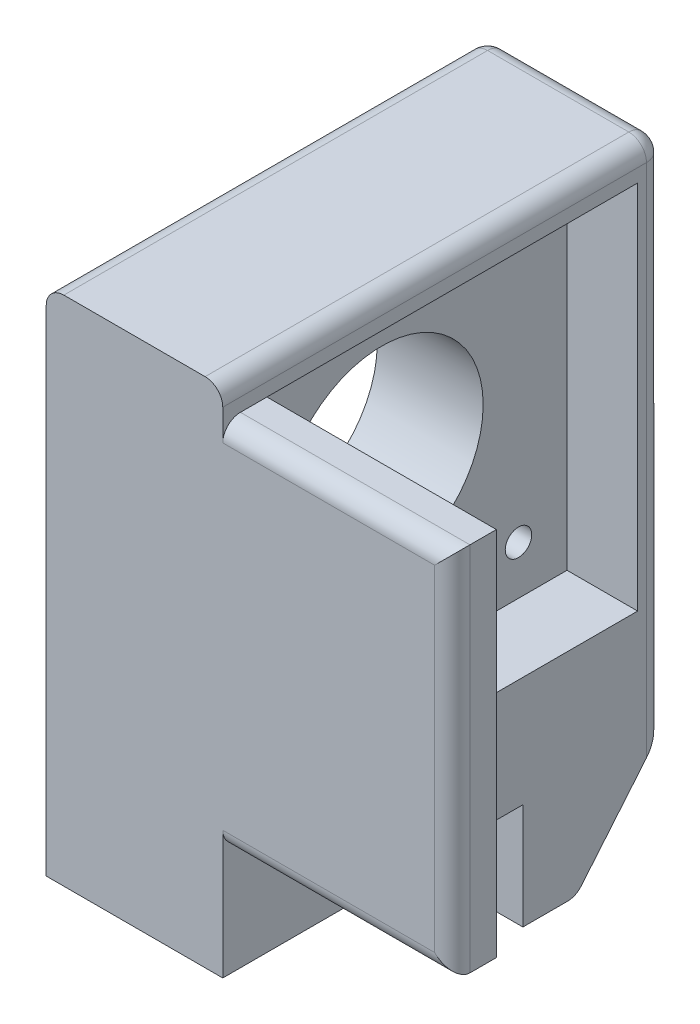
ISO-10303-21;
HEADER;
FILE_DESCRIPTION(('STEP AP214'),'2;1');
FILE_NAME('part.step','',(''),(''),'','','');
FILE_SCHEMA(('AUTOMOTIVE_DESIGN { 1 0 10303 214 1 1 1 1 }'));
ENDSEC;
DATA;
#1=APPLICATION_CONTEXT('core data for automotive mechanical design processes');
#2=APPLICATION_PROTOCOL_DEFINITION('international standard','automotive_design',2000,#1);
#3=PRODUCT_CONTEXT('',#1,'mechanical');
#4=PRODUCT('Part','Part','',(#3));
#5=PRODUCT_RELATED_PRODUCT_CATEGORY('part','',(#4));
#6=PRODUCT_DEFINITION_FORMATION('','',#4);
#7=PRODUCT_DEFINITION_CONTEXT('part definition',#1,'design');
#8=PRODUCT_DEFINITION('design','',#6,#7);
#9=PRODUCT_DEFINITION_SHAPE('','',#8);
#10=(LENGTH_UNIT() NAMED_UNIT(*) SI_UNIT(.MILLI.,.METRE.));
#11=(NAMED_UNIT(*) PLANE_ANGLE_UNIT() SI_UNIT($,.RADIAN.));
#12=(NAMED_UNIT(*) SI_UNIT($,.STERADIAN.) SOLID_ANGLE_UNIT());
#13=UNCERTAINTY_MEASURE_WITH_UNIT(LENGTH_MEASURE(1.E-05),#10,'distance_accuracy_value','');
#14=(GEOMETRIC_REPRESENTATION_CONTEXT(3) GLOBAL_UNCERTAINTY_ASSIGNED_CONTEXT((#13)) GLOBAL_UNIT_ASSIGNED_CONTEXT((#10,
#11,#12)) REPRESENTATION_CONTEXT('',''));
#15=CARTESIAN_POINT('',(0.,0.,0.));
#16=DIRECTION('',(0.,0.,1.));
#17=DIRECTION('',(1.,0.,0.));
#18=AXIS2_PLACEMENT_3D('',#15,#16,#17);
#19=CARTESIAN_POINT('',(0.,70.,0.));
#20=DIRECTION('',(-1.,0.,0.));
#21=DIRECTION('',(0.,0.,1.));
#22=AXIS2_PLACEMENT_3D('',#19,#20,#21);
#23=PLANE('',#22);
#24=DIRECTION('',(0.,0.,1.));
#25=VECTOR('',#24,1.);
#26=CARTESIAN_POINT('',(0.,66.5,45.));
#27=LINE('',#26,#25);
#28=CARTESIAN_POINT('',(0.,66.5,45.));
#29=VERTEX_POINT('',#28);
#30=CARTESIAN_POINT('',(0.,66.5,48.));
#31=VERTEX_POINT('',#30);
#32=EDGE_CURVE('E420',#29,#31,#27,.T.);
#33=ORIENTED_EDGE('',*,*,#32,.F.);
#34=DIRECTION('',(0.,0.,1.));
#35=VECTOR('',#34,1.);
#36=CARTESIAN_POINT('',(0.,66.5,3.));
#37=LINE('',#36,#35);
#38=CARTESIAN_POINT('',(0.,66.5,3.));
#39=VERTEX_POINT('',#38);
#40=EDGE_CURVE('E263',#39,#29,#37,.T.);
#41=ORIENTED_EDGE('',*,*,#40,.F.);
#42=DIRECTION('',(0.,1.,0.));
#43=VECTOR('',#42,1.);
#44=CARTESIAN_POINT('',(0.,66.5,3.));
#45=LINE('',#44,#43);
#46=CARTESIAN_POINT('',(0.,24.5,3.));
#47=VERTEX_POINT('',#46);
#48=EDGE_CURVE('E247',#47,#39,#45,.T.);
#49=ORIENTED_EDGE('',*,*,#48,.F.);
#50=DIRECTION('',(0.,0.,-1.));
#51=VECTOR('',#50,1.);
#52=CARTESIAN_POINT('',(0.,24.5,3.));
#53=LINE('',#52,#51);
#54=CARTESIAN_POINT('',(0.,24.5,45.));
#55=VERTEX_POINT('',#54);
#56=EDGE_CURVE('E252',#55,#47,#53,.T.);
#57=ORIENTED_EDGE('',*,*,#56,.F.);
#58=DIRECTION('',(0.,0.,-1.));
#59=VECTOR('',#58,1.);
#60=CARTESIAN_POINT('',(0.,24.5,45.));
#61=LINE('',#60,#59);
#62=CARTESIAN_POINT('',(0.,24.5,48.));
#63=VERTEX_POINT('',#62);
#64=EDGE_CURVE('E201',#63,#55,#61,.T.);
#65=ORIENTED_EDGE('',*,*,#64,.F.);
#66=CARTESIAN_POINT('',(0.,26.5,48.));
#67=DIRECTION('',(-1.,0.,0.));
#68=DIRECTION('',(0.,0.,1.));
#69=AXIS2_PLACEMENT_3D('',#66,#67,#68);
#70=CIRCLE('',#69,2.);
#71=CARTESIAN_POINT('',(0.,26.5,50.));
#72=VERTEX_POINT('',#71);
#73=EDGE_CURVE('E11',#63,#72,#70,.T.);
#74=ORIENTED_EDGE('',*,*,#73,.T.);
#75=DIRECTION('',(0.,-1.,0.));
#76=VECTOR('',#75,1.);
#77=CARTESIAN_POINT('',(0.,70.,50.));
#78=LINE('',#77,#76);
#79=CARTESIAN_POINT('',(0.,12.,50.));
#80=VERTEX_POINT('',#79);
#81=EDGE_CURVE('E315',#72,#80,#78,.T.);
#82=ORIENTED_EDGE('',*,*,#81,.T.);
#83=DIRECTION('',(0.,0.,1.));
#84=VECTOR('',#83,1.);
#85=CARTESIAN_POINT('',(0.,12.,50.));
#86=LINE('',#85,#84);
#87=CARTESIAN_POINT('',(0.,12.,16.));
#88=VERTEX_POINT('',#87);
#89=EDGE_CURVE('E297',#88,#80,#86,.T.);
#90=ORIENTED_EDGE('',*,*,#89,.F.);
#91=DIRECTION('',(0.,1.,0.));
#92=VECTOR('',#91,1.);
#93=CARTESIAN_POINT('',(0.,0.,16.));
#94=LINE('',#93,#92);
#95=CARTESIAN_POINT('',(0.,0.,16.));
#96=VERTEX_POINT('',#95);
#97=EDGE_CURVE('E292',#96,#88,#94,.T.);
#98=ORIENTED_EDGE('',*,*,#97,.F.);
#99=DIRECTION('',(0.,0.,-1.));
#100=VECTOR('',#99,1.);
#101=CARTESIAN_POINT('',(0.,0.,0.));
#102=LINE('',#101,#100);
#103=CARTESIAN_POINT('',(0.,0.,10.9367498919689));
#104=VERTEX_POINT('',#103);
#105=EDGE_CURVE('E317',#96,#104,#102,.T.);
#106=ORIENTED_EDGE('',*,*,#105,.T.);
#107=CARTESIAN_POINT('',(0.,2.,10.9367498919689));
#108=DIRECTION('',(-1.,0.,0.));
#109=DIRECTION('',(0.,0.,1.));
#110=AXIS2_PLACEMENT_3D('',#107,#108,#109);
#111=CIRCLE('',#110,2.);
#112=CARTESIAN_POINT('',(0.,0.719631200671042,9.40030733277413));
#113=VERTEX_POINT('',#112);
#114=EDGE_CURVE('E398',#104,#113,#111,.F.);
#115=ORIENTED_EDGE('',*,*,#114,.T.);
#116=DIRECTION('',(0.,-0.768221279597376,0.64018439966448));
#117=VECTOR('',#116,1.);
#118=CARTESIAN_POINT('',(0.,12.,0.));
#119=LINE('',#118,#117);
#120=CARTESIAN_POINT('',(0.,9.6,2.));
#121=VERTEX_POINT('',#120);
#122=EDGE_CURVE('E237',#121,#113,#119,.T.);
#123=ORIENTED_EDGE('',*,*,#122,.F.);
#124=DIRECTION('',(0.,-1.,0.));
#125=VECTOR('',#124,1.);
#126=CARTESIAN_POINT('',(0.,70.,2.));
#127=LINE('',#126,#125);
#128=CARTESIAN_POINT('',(0.,68.,2.));
#129=VERTEX_POINT('',#128);
#130=EDGE_CURVE('E385',#121,#129,#127,.F.);
#131=ORIENTED_EDGE('',*,*,#130,.T.);
#132=DIRECTION('',(0.,0.,-1.));
#133=VECTOR('',#132,1.);
#134=CARTESIAN_POINT('',(0.,68.,0.));
#135=LINE('',#134,#133);
#136=CARTESIAN_POINT('',(0.,68.,50.));
#137=VERTEX_POINT('',#136);
#138=EDGE_CURVE('E383',#129,#137,#135,.F.);
#139=ORIENTED_EDGE('',*,*,#138,.T.);
#140=CARTESIAN_POINT('',(0.,64.5,50.));
#141=VERTEX_POINT('',#140);
#142=EDGE_CURVE('E322',#137,#141,#78,.T.);
#143=ORIENTED_EDGE('',*,*,#142,.T.);
#144=CARTESIAN_POINT('',(0.,64.5,48.));
#145=DIRECTION('',(-1.,0.,0.));
#146=DIRECTION('',(0.,0.,1.));
#147=AXIS2_PLACEMENT_3D('',#144,#145,#146);
#148=CIRCLE('',#147,2.);
#149=EDGE_CURVE('E49',#141,#31,#148,.T.);
#150=ORIENTED_EDGE('',*,*,#149,.T.);
#151=EDGE_LOOP('',(#33,#41,#49,#57,#65,#74,#82,#90,#98,#106,#115,#123,#131,#139,#143,#150));
#152=FACE_BOUND('',#151,.T.);
#153=ADVANCED_FACE('F40',(#152),#23,.F.);
#154=CARTESIAN_POINT('',(0.,70.,0.));
#155=DIRECTION('',(0.,0.,1.));
#156=DIRECTION('',(1.,0.,0.));
#157=AXIS2_PLACEMENT_3D('',#154,#155,#156);
#158=PLANE('',#157);
#159=DIRECTION('',(-1.,0.,0.));
#160=VECTOR('',#159,1.);
#161=CARTESIAN_POINT('',(0.,68.,0.));
#162=LINE('',#161,#160);
#163=CARTESIAN_POINT('',(-18.,68.,0.));
#164=VERTEX_POINT('',#163);
#165=CARTESIAN_POINT('',(-2.,68.,0.));
#166=VERTEX_POINT('',#165);
#167=EDGE_CURVE('E364',#164,#166,#162,.F.);
#168=ORIENTED_EDGE('',*,*,#167,.T.);
#169=DIRECTION('',(0.,-1.,0.));
#170=VECTOR('',#169,1.);
#171=CARTESIAN_POINT('',(-2.,70.,0.));
#172=LINE('',#171,#170);
#173=CARTESIAN_POINT('',(-2.,12.,0.));
#174=VERTEX_POINT('',#173);
#175=EDGE_CURVE('E373',#166,#174,#172,.T.);
#176=ORIENTED_EDGE('',*,*,#175,.T.);
#177=DIRECTION('',(1.,0.,0.));
#178=VECTOR('',#177,1.);
#179=CARTESIAN_POINT('',(-30.,12.,0.));
#180=LINE('',#179,#178);
#181=CARTESIAN_POINT('',(-18.,12.,0.));
#182=VERTEX_POINT('',#181);
#183=EDGE_CURVE('E240',#182,#174,#180,.T.);
#184=ORIENTED_EDGE('',*,*,#183,.F.);
#185=DIRECTION('',(0.,-1.,0.));
#186=VECTOR('',#185,1.);
#187=CARTESIAN_POINT('',(-18.,70.,0.));
#188=LINE('',#187,#186);
#189=EDGE_CURVE('E357',#182,#164,#188,.F.);
#190=ORIENTED_EDGE('',*,*,#189,.T.);
#191=EDGE_LOOP('',(#168,#176,#184,#190));
#192=FACE_BOUND('',#191,.T.);
#193=ADVANCED_FACE('F466',(#192),#158,.F.);
#194=CARTESIAN_POINT('',(-20.,70.,0.));
#195=DIRECTION('',(1.,0.,0.));
#196=DIRECTION('',(0.,0.,-1.));
#197=AXIS2_PLACEMENT_3D('',#194,#195,#196);
#198=PLANE('',#197);
#199=CARTESIAN_POINT('',(-20.,20.,46.));
#200=DIRECTION('',(-1.,0.,0.));
#201=DIRECTION('',(0.,0.,1.));
#202=AXIS2_PLACEMENT_3D('',#199,#200,#201);
#203=CIRCLE('',#202,1.5);
#204=CARTESIAN_POINT('',(-20.,20.,47.5));
#205=VERTEX_POINT('',#204);
#206=EDGE_CURVE('E221',#205,#205,#203,.T.);
#207=ORIENTED_EDGE('',*,*,#206,.F.);
#208=EDGE_LOOP('',(#207));
#209=FACE_BOUND('',#208,.T.);
#210=CARTESIAN_POINT('',(-20.,20.,39.));
#211=DIRECTION('',(-1.,0.,0.));
#212=DIRECTION('',(0.,0.,1.));
#213=AXIS2_PLACEMENT_3D('',#210,#211,#212);
#214=CIRCLE('',#213,1.5);
#215=CARTESIAN_POINT('',(-20.,20.,40.5));
#216=VERTEX_POINT('',#215);
#217=EDGE_CURVE('E227',#216,#216,#214,.T.);
#218=ORIENTED_EDGE('',*,*,#217,.F.);
#219=EDGE_LOOP('',(#218));
#220=FACE_BOUND('',#219,.T.);
#221=CARTESIAN_POINT('',(-20.,45.5,24.));
#222=DIRECTION('',(1.,0.,0.));
#223=DIRECTION('',(0.,0.,-1.));
#224=AXIS2_PLACEMENT_3D('',#221,#222,#223);
#225=CIRCLE('',#224,11.5);
#226=CARTESIAN_POINT('',(-20.,45.5,12.5));
#227=VERTEX_POINT('',#226);
#228=EDGE_CURVE('E320',#227,#227,#225,.T.);
#229=ORIENTED_EDGE('',*,*,#228,.T.);
#230=EDGE_LOOP('',(#229));
#231=FACE_BOUND('',#230,.T.);
#232=CARTESIAN_POINT('',(-20.,61.,39.5));
#233=DIRECTION('',(1.,0.,0.));
#234=DIRECTION('',(0.,0.,-1.));
#235=AXIS2_PLACEMENT_3D('',#232,#233,#234);
#236=CIRCLE('',#235,1.5);
#237=CARTESIAN_POINT('',(-20.,61.,38.));
#238=VERTEX_POINT('',#237);
#239=EDGE_CURVE('E335',#238,#238,#236,.T.);
#240=ORIENTED_EDGE('',*,*,#239,.T.);
#241=EDGE_LOOP('',(#240));
#242=FACE_BOUND('',#241,.T.);
#243=CARTESIAN_POINT('',(-20.,30.,39.5));
#244=DIRECTION('',(1.,0.,0.));
#245=DIRECTION('',(0.,0.,-1.));
#246=AXIS2_PLACEMENT_3D('',#243,#244,#245);
#247=CIRCLE('',#246,1.5);
#248=CARTESIAN_POINT('',(-20.,30.,38.));
#249=VERTEX_POINT('',#248);
#250=EDGE_CURVE('E332',#249,#249,#247,.T.);
#251=ORIENTED_EDGE('',*,*,#250,.T.);
#252=EDGE_LOOP('',(#251));
#253=FACE_BOUND('',#252,.T.);
#254=CARTESIAN_POINT('',(-20.,30.,8.50000000000001));
#255=DIRECTION('',(1.,0.,0.));
#256=DIRECTION('',(0.,0.,-1.));
#257=AXIS2_PLACEMENT_3D('',#254,#255,#256);
#258=CIRCLE('',#257,1.5);
#259=CARTESIAN_POINT('',(-20.,30.,7.00000000000001));
#260=VERTEX_POINT('',#259);
#261=EDGE_CURVE('E329',#260,#260,#258,.T.);
#262=ORIENTED_EDGE('',*,*,#261,.T.);
#263=EDGE_LOOP('',(#262));
#264=FACE_BOUND('',#263,.T.);
#265=CARTESIAN_POINT('',(-20.,61.,8.50000000000001));
#266=DIRECTION('',(1.,0.,0.));
#267=DIRECTION('',(0.,0.,-1.));
#268=AXIS2_PLACEMENT_3D('',#265,#266,#267);
#269=CIRCLE('',#268,1.5);
#270=CARTESIAN_POINT('',(-20.,61.,7.00000000000001));
#271=VERTEX_POINT('',#270);
#272=EDGE_CURVE('E311',#271,#271,#269,.T.);
#273=ORIENTED_EDGE('',*,*,#272,.T.);
#274=EDGE_LOOP('',(#273));
#275=FACE_BOUND('',#274,.T.);
#276=DIRECTION('',(0.,-0.768221279597376,0.64018439966448));
#277=VECTOR('',#276,1.);
#278=CARTESIAN_POINT('',(-20.,46.2295081967213,-28.5245901639344));
#279=LINE('',#278,#277);
#280=CARTESIAN_POINT('',(-20.,9.59999999999999,2.00000000000001));
#281=VERTEX_POINT('',#280);
#282=CARTESIAN_POINT('',(-20.,0.719631200671034,9.40030733277414));
#283=VERTEX_POINT('',#282);
#284=EDGE_CURVE('E244',#281,#283,#279,.T.);
#285=ORIENTED_EDGE('',*,*,#284,.T.);
#286=CARTESIAN_POINT('',(-20.,2.,10.9367498919689));
#287=DIRECTION('',(1.,0.,0.));
#288=DIRECTION('',(0.,0.,-1.));
#289=AXIS2_PLACEMENT_3D('',#286,#287,#288);
#290=CIRCLE('',#289,2.);
#291=CARTESIAN_POINT('',(-20.,0.,10.9367498919689));
#292=VERTEX_POINT('',#291);
#293=EDGE_CURVE('E402',#283,#292,#290,.F.);
#294=ORIENTED_EDGE('',*,*,#293,.T.);
#295=DIRECTION('',(0.,0.,1.));
#296=VECTOR('',#295,1.);
#297=CARTESIAN_POINT('',(-20.,0.,0.));
#298=LINE('',#297,#296);
#299=CARTESIAN_POINT('',(-20.,0.,16.));
#300=VERTEX_POINT('',#299);
#301=EDGE_CURVE('E316',#292,#300,#298,.T.);
#302=ORIENTED_EDGE('',*,*,#301,.T.);
#303=DIRECTION('',(0.,1.,0.));
#304=VECTOR('',#303,1.);
#305=CARTESIAN_POINT('',(-20.,70.,16.));
#306=LINE('',#305,#304);
#307=CARTESIAN_POINT('',(-20.,12.,16.));
#308=VERTEX_POINT('',#307);
#309=EDGE_CURVE('E304',#300,#308,#306,.T.);
#310=ORIENTED_EDGE('',*,*,#309,.T.);
#311=DIRECTION('',(0.,0.,1.));
#312=VECTOR('',#311,1.);
#313=CARTESIAN_POINT('',(-20.,12.,0.));
#314=LINE('',#313,#312);
#315=CARTESIAN_POINT('',(-20.,12.,50.));
#316=VERTEX_POINT('',#315);
#317=EDGE_CURVE('E308',#308,#316,#314,.T.);
#318=ORIENTED_EDGE('',*,*,#317,.T.);
#319=DIRECTION('',(0.,-1.,0.));
#320=VECTOR('',#319,1.);
#321=CARTESIAN_POINT('',(-20.,70.,50.));
#322=LINE('',#321,#320);
#323=CARTESIAN_POINT('',(-20.,68.,50.));
#324=VERTEX_POINT('',#323);
#325=EDGE_CURVE('E324',#324,#316,#322,.T.);
#326=ORIENTED_EDGE('',*,*,#325,.F.);
#327=DIRECTION('',(0.,0.,1.));
#328=VECTOR('',#327,1.);
#329=CARTESIAN_POINT('',(-20.,68.,0.));
#330=LINE('',#329,#328);
#331=CARTESIAN_POINT('',(-20.,68.,2.));
#332=VERTEX_POINT('',#331);
#333=EDGE_CURVE('E371',#324,#332,#330,.F.);
#334=ORIENTED_EDGE('',*,*,#333,.T.);
#335=DIRECTION('',(0.,-1.,0.));
#336=VECTOR('',#335,1.);
#337=CARTESIAN_POINT('',(-20.,70.,2.));
#338=LINE('',#337,#336);
#339=EDGE_CURVE('E341',#332,#281,#338,.T.);
#340=ORIENTED_EDGE('',*,*,#339,.T.);
#341=EDGE_LOOP('',(#285,#294,#302,#310,#318,#326,#334,#340));
#342=FACE_BOUND('',#341,.T.);
#343=ADVANCED_FACE('F462',(#209,#220,#231,#242,#253,#264,#275,#342),#198,.F.);
#344=CARTESIAN_POINT('',(0.,70.,50.));
#345=DIRECTION('',(0.,0.,-1.));
#346=DIRECTION('',(-1.,0.,0.));
#347=AXIS2_PLACEMENT_3D('',#344,#345,#346);
#348=PLANE('',#347);
#349=DIRECTION('',(-1.,0.,0.));
#350=VECTOR('',#349,1.);
#351=CARTESIAN_POINT('',(0.,64.5,50.));
#352=LINE('',#351,#350);
#353=CARTESIAN_POINT('',(24.,64.5,50.));
#354=VERTEX_POINT('',#353);
#355=EDGE_CURVE('E408',#354,#141,#352,.T.);
#356=ORIENTED_EDGE('',*,*,#355,.T.);
#357=ORIENTED_EDGE('',*,*,#142,.F.);
#358=CARTESIAN_POINT('',(-1.99999999999999,68.,50.));
#359=DIRECTION('',(0.,0.,-1.));
#360=DIRECTION('',(-1.,0.,0.));
#361=AXIS2_PLACEMENT_3D('',#358,#359,#360);
#362=CIRCLE('',#361,2.);
#363=CARTESIAN_POINT('',(-1.99999999999999,70.,50.));
#364=VERTEX_POINT('',#363);
#365=EDGE_CURVE('E391',#137,#364,#362,.F.);
#366=ORIENTED_EDGE('',*,*,#365,.T.);
#367=DIRECTION('',(1.,0.,0.));
#368=VECTOR('',#367,1.);
#369=CARTESIAN_POINT('',(0.,70.,50.));
#370=LINE('',#369,#368);
#371=CARTESIAN_POINT('',(-18.,70.,50.));
#372=VERTEX_POINT('',#371);
#373=EDGE_CURVE('E312',#372,#364,#370,.T.);
#374=ORIENTED_EDGE('',*,*,#373,.F.);
#375=CARTESIAN_POINT('',(-18.,68.,50.));
#376=DIRECTION('',(0.,0.,-1.));
#377=DIRECTION('',(-1.,0.,0.));
#378=AXIS2_PLACEMENT_3D('',#375,#376,#377);
#379=CIRCLE('',#378,2.);
#380=EDGE_CURVE('E369',#372,#324,#379,.F.);
#381=ORIENTED_EDGE('',*,*,#380,.T.);
#382=ORIENTED_EDGE('',*,*,#325,.T.);
#383=DIRECTION('',(1.,0.,0.));
#384=VECTOR('',#383,1.);
#385=CARTESIAN_POINT('',(-60.,12.,50.));
#386=LINE('',#385,#384);
#387=EDGE_CURVE('E301',#316,#80,#386,.T.);
#388=ORIENTED_EDGE('',*,*,#387,.T.);
#389=ORIENTED_EDGE('',*,*,#81,.F.);
#390=DIRECTION('',(-1.,0.,0.));
#391=VECTOR('',#390,1.);
#392=CARTESIAN_POINT('',(0.,26.5,50.));
#393=LINE('',#392,#391);
#394=CARTESIAN_POINT('',(24.,26.5,50.));
#395=VERTEX_POINT('',#394);
#396=EDGE_CURVE('E404',#72,#395,#393,.F.);
#397=ORIENTED_EDGE('',*,*,#396,.T.);
#398=DIRECTION('',(0.,-1.,0.));
#399=VECTOR('',#398,1.);
#400=CARTESIAN_POINT('',(24.,70.,50.));
#401=LINE('',#400,#399);
#402=EDGE_CURVE('E406',#395,#354,#401,.F.);
#403=ORIENTED_EDGE('',*,*,#402,.T.);
#404=EDGE_LOOP('',(#356,#357,#366,#374,#381,#382,#388,#389,#397,#403));
#405=FACE_BOUND('',#404,.T.);
#406=ADVANCED_FACE('F465',(#405),#348,.F.);
#407=CARTESIAN_POINT('',(0.,70.,0.));
#408=DIRECTION('',(0.,-1.,0.));
#409=DIRECTION('',(0.,0.,-1.));
#410=AXIS2_PLACEMENT_3D('',#407,#408,#409);
#411=PLANE('',#410);
#412=ORIENTED_EDGE('',*,*,#373,.T.);
#413=DIRECTION('',(0.,0.,-1.));
#414=VECTOR('',#413,1.);
#415=CARTESIAN_POINT('',(-2.,70.,0.));
#416=LINE('',#415,#414);
#417=CARTESIAN_POINT('',(-2.,70.,2.));
#418=VERTEX_POINT('',#417);
#419=EDGE_CURVE('E389',#364,#418,#416,.T.);
#420=ORIENTED_EDGE('',*,*,#419,.T.);
#421=DIRECTION('',(-1.,0.,0.));
#422=VECTOR('',#421,1.);
#423=CARTESIAN_POINT('',(0.,70.,2.));
#424=LINE('',#423,#422);
#425=CARTESIAN_POINT('',(-18.,70.,2.));
#426=VERTEX_POINT('',#425);
#427=EDGE_CURVE('E362',#418,#426,#424,.T.);
#428=ORIENTED_EDGE('',*,*,#427,.T.);
#429=DIRECTION('',(0.,0.,1.));
#430=VECTOR('',#429,1.);
#431=CARTESIAN_POINT('',(-18.,70.,0.));
#432=LINE('',#431,#430);
#433=EDGE_CURVE('E360',#426,#372,#432,.T.);
#434=ORIENTED_EDGE('',*,*,#433,.T.);
#435=EDGE_LOOP('',(#412,#420,#428,#434));
#436=FACE_BOUND('',#435,.T.);
#437=ADVANCED_FACE('F528',(#436),#411,.F.);
#438=CARTESIAN_POINT('',(0.,0.,0.));
#439=DIRECTION('',(0.,-1.,0.));
#440=DIRECTION('',(0.,0.,-1.));
#441=AXIS2_PLACEMENT_3D('',#438,#439,#440);
#442=PLANE('',#441);
#443=ORIENTED_EDGE('',*,*,#301,.F.);
#444=DIRECTION('',(1.,0.,0.));
#445=VECTOR('',#444,1.);
#446=CARTESIAN_POINT('',(0.,0.,10.9367498919689));
#447=LINE('',#446,#445);
#448=EDGE_CURVE('E392',#292,#104,#447,.T.);
#449=ORIENTED_EDGE('',*,*,#448,.T.);
#450=ORIENTED_EDGE('',*,*,#105,.F.);
#451=DIRECTION('',(1.,0.,0.));
#452=VECTOR('',#451,1.);
#453=CARTESIAN_POINT('',(0.,0.,16.));
#454=LINE('',#453,#452);
#455=EDGE_CURVE('E326',#300,#96,#454,.T.);
#456=ORIENTED_EDGE('',*,*,#455,.F.);
#457=EDGE_LOOP('',(#443,#449,#450,#456));
#458=FACE_BOUND('',#457,.T.);
#459=ADVANCED_FACE('F458',(#458),#442,.T.);
#460=CARTESIAN_POINT('',(-60.,61.,8.50000000000001));
#461=DIRECTION('',(1.,0.,0.));
#462=DIRECTION('',(0.,0.,-1.));
#463=AXIS2_PLACEMENT_3D('',#460,#461,#462);
#464=CYLINDRICAL_SURFACE('',#463,1.5);
#465=CARTESIAN_POINT('',(-8.,61.,8.50000000000001));
#466=DIRECTION('',(-1.,0.,0.));
#467=DIRECTION('',(0.,0.,1.));
#468=AXIS2_PLACEMENT_3D('',#465,#466,#467);
#469=CIRCLE('',#468,1.5);
#470=CARTESIAN_POINT('',(-8.,61.,10.));
#471=VERTEX_POINT('',#470);
#472=EDGE_CURVE('E285',#471,#471,#469,.F.);
#473=ORIENTED_EDGE('',*,*,#472,.T.);
#474=EDGE_LOOP('',(#473));
#475=FACE_BOUND('',#474,.T.);
#476=ORIENTED_EDGE('',*,*,#272,.F.);
#477=EDGE_LOOP('',(#476));
#478=FACE_BOUND('',#477,.T.);
#479=ADVANCED_FACE('F454',(#475,#478),#464,.F.);
#480=CARTESIAN_POINT('',(-60.,30.,8.50000000000001));
#481=DIRECTION('',(1.,0.,0.));
#482=DIRECTION('',(0.,0.,-1.));
#483=AXIS2_PLACEMENT_3D('',#480,#481,#482);
#484=CYLINDRICAL_SURFACE('',#483,1.5);
#485=CARTESIAN_POINT('',(-8.,30.,8.5));
#486=DIRECTION('',(-1.,0.,0.));
#487=DIRECTION('',(0.,0.,1.));
#488=AXIS2_PLACEMENT_3D('',#485,#486,#487);
#489=CIRCLE('',#488,1.5);
#490=CARTESIAN_POINT('',(-8.,30.,10.));
#491=VERTEX_POINT('',#490);
#492=EDGE_CURVE('E282',#491,#491,#489,.F.);
#493=ORIENTED_EDGE('',*,*,#492,.T.);
#494=EDGE_LOOP('',(#493));
#495=FACE_BOUND('',#494,.T.);
#496=ORIENTED_EDGE('',*,*,#261,.F.);
#497=EDGE_LOOP('',(#496));
#498=FACE_BOUND('',#497,.T.);
#499=ADVANCED_FACE('F457',(#495,#498),#484,.F.);
#500=CARTESIAN_POINT('',(-60.,30.,39.5));
#501=DIRECTION('',(1.,0.,0.));
#502=DIRECTION('',(0.,0.,-1.));
#503=AXIS2_PLACEMENT_3D('',#500,#501,#502);
#504=CYLINDRICAL_SURFACE('',#503,1.5);
#505=CARTESIAN_POINT('',(-7.99999999999999,30.,39.5));
#506=DIRECTION('',(-1.,0.,0.));
#507=DIRECTION('',(0.,0.,1.));
#508=AXIS2_PLACEMENT_3D('',#505,#506,#507);
#509=CIRCLE('',#508,1.5);
#510=CARTESIAN_POINT('',(-7.99999999999999,30.,41.));
#511=VERTEX_POINT('',#510);
#512=EDGE_CURVE('E279',#511,#511,#509,.F.);
#513=ORIENTED_EDGE('',*,*,#512,.T.);
#514=EDGE_LOOP('',(#513));
#515=FACE_BOUND('',#514,.T.);
#516=ORIENTED_EDGE('',*,*,#250,.F.);
#517=EDGE_LOOP('',(#516));
#518=FACE_BOUND('',#517,.T.);
#519=ADVANCED_FACE('F649',(#515,#518),#504,.F.);
#520=CARTESIAN_POINT('',(-60.,61.,39.5));
#521=DIRECTION('',(1.,0.,0.));
#522=DIRECTION('',(0.,0.,-1.));
#523=AXIS2_PLACEMENT_3D('',#520,#521,#522);
#524=CYLINDRICAL_SURFACE('',#523,1.5);
#525=CARTESIAN_POINT('',(-7.99999999999999,61.,39.5));
#526=DIRECTION('',(-1.,0.,0.));
#527=DIRECTION('',(0.,0.,1.));
#528=AXIS2_PLACEMENT_3D('',#525,#526,#527);
#529=CIRCLE('',#528,1.5);
#530=CARTESIAN_POINT('',(-7.99999999999999,61.,41.));
#531=VERTEX_POINT('',#530);
#532=EDGE_CURVE('E276',#531,#531,#529,.F.);
#533=ORIENTED_EDGE('',*,*,#532,.T.);
#534=EDGE_LOOP('',(#533));
#535=FACE_BOUND('',#534,.T.);
#536=ORIENTED_EDGE('',*,*,#239,.F.);
#537=EDGE_LOOP('',(#536));
#538=FACE_BOUND('',#537,.T.);
#539=ADVANCED_FACE('F653',(#535,#538),#524,.F.);
#540=CARTESIAN_POINT('',(-60.,45.5,24.));
#541=DIRECTION('',(1.,0.,0.));
#542=DIRECTION('',(0.,0.,-1.));
#543=AXIS2_PLACEMENT_3D('',#540,#541,#542);
#544=CYLINDRICAL_SURFACE('',#543,11.5);
#545=CARTESIAN_POINT('',(-8.,45.5,24.));
#546=DIRECTION('',(-1.,0.,0.));
#547=DIRECTION('',(0.,0.,1.));
#548=AXIS2_PLACEMENT_3D('',#545,#546,#547);
#549=CIRCLE('',#548,11.5);
#550=CARTESIAN_POINT('',(-8.,45.5,35.5));
#551=VERTEX_POINT('',#550);
#552=EDGE_CURVE('E269',#551,#551,#549,.F.);
#553=ORIENTED_EDGE('',*,*,#552,.T.);
#554=EDGE_LOOP('',(#553));
#555=FACE_BOUND('',#554,.T.);
#556=ORIENTED_EDGE('',*,*,#228,.F.);
#557=EDGE_LOOP('',(#556));
#558=FACE_BOUND('',#557,.T.);
#559=ADVANCED_FACE('F644',(#555,#558),#544,.F.);
#560=CARTESIAN_POINT('',(-60.,12.,50.));
#561=DIRECTION('',(0.,1.,0.));
#562=DIRECTION('',(0.,0.,1.));
#563=AXIS2_PLACEMENT_3D('',#560,#561,#562);
#564=PLANE('',#563);
#565=DIRECTION('',(1.,0.,0.));
#566=VECTOR('',#565,1.);
#567=CARTESIAN_POINT('',(-60.,12.,16.));
#568=LINE('',#567,#566);
#569=EDGE_CURVE('E300',#308,#88,#568,.T.);
#570=ORIENTED_EDGE('',*,*,#569,.T.);
#571=ORIENTED_EDGE('',*,*,#89,.T.);
#572=ORIENTED_EDGE('',*,*,#387,.F.);
#573=ORIENTED_EDGE('',*,*,#317,.F.);
#574=EDGE_LOOP('',(#570,#571,#572,#573));
#575=FACE_BOUND('',#574,.T.);
#576=ADVANCED_FACE('F492',(#575),#564,.F.);
#577=CARTESIAN_POINT('',(-60.,0.,16.));
#578=DIRECTION('',(0.,0.,-1.));
#579=DIRECTION('',(-1.,0.,0.));
#580=AXIS2_PLACEMENT_3D('',#577,#578,#579);
#581=PLANE('',#580);
#582=ORIENTED_EDGE('',*,*,#455,.T.);
#583=ORIENTED_EDGE('',*,*,#97,.T.);
#584=ORIENTED_EDGE('',*,*,#569,.F.);
#585=ORIENTED_EDGE('',*,*,#309,.F.);
#586=EDGE_LOOP('',(#582,#583,#584,#585));
#587=FACE_BOUND('',#586,.T.);
#588=ADVANCED_FACE('F445',(#587),#581,.F.);
#589=CARTESIAN_POINT('',(-8.,0.,0.));
#590=DIRECTION('',(-1.,0.,0.));
#591=DIRECTION('',(0.,0.,1.));
#592=AXIS2_PLACEMENT_3D('',#589,#590,#591);
#593=PLANE('',#592);
#594=ORIENTED_EDGE('',*,*,#492,.F.);
#595=EDGE_LOOP('',(#594));
#596=FACE_BOUND('',#595,.T.);
#597=ORIENTED_EDGE('',*,*,#532,.F.);
#598=EDGE_LOOP('',(#597));
#599=FACE_BOUND('',#598,.T.);
#600=DIRECTION('',(0.,1.,0.));
#601=VECTOR('',#600,1.);
#602=CARTESIAN_POINT('',(-8.,66.5,3.));
#603=LINE('',#602,#601);
#604=CARTESIAN_POINT('',(-8.,24.5,3.));
#605=VERTEX_POINT('',#604);
#606=CARTESIAN_POINT('',(-8.,66.5,3.));
#607=VERTEX_POINT('',#606);
#608=EDGE_CURVE('E248',#605,#607,#603,.T.);
#609=ORIENTED_EDGE('',*,*,#608,.T.);
#610=DIRECTION('',(0.,0.,1.));
#611=VECTOR('',#610,1.);
#612=CARTESIAN_POINT('',(-8.,66.5,3.));
#613=LINE('',#612,#611);
#614=CARTESIAN_POINT('',(-7.99999999999999,66.5,45.));
#615=VERTEX_POINT('',#614);
#616=EDGE_CURVE('E251',#607,#615,#613,.T.);
#617=ORIENTED_EDGE('',*,*,#616,.T.);
#618=DIRECTION('',(0.,-1.,0.));
#619=VECTOR('',#618,1.);
#620=CARTESIAN_POINT('',(-7.99999999999999,66.5,45.));
#621=LINE('',#620,#619);
#622=CARTESIAN_POINT('',(-7.99999999999999,24.5,45.));
#623=VERTEX_POINT('',#622);
#624=EDGE_CURVE('E255',#615,#623,#621,.T.);
#625=ORIENTED_EDGE('',*,*,#624,.T.);
#626=DIRECTION('',(0.,0.,-1.));
#627=VECTOR('',#626,1.);
#628=CARTESIAN_POINT('',(-8.,24.5,3.));
#629=LINE('',#628,#627);
#630=EDGE_CURVE('E258',#623,#605,#629,.T.);
#631=ORIENTED_EDGE('',*,*,#630,.T.);
#632=EDGE_LOOP('',(#609,#617,#625,#631));
#633=FACE_BOUND('',#632,.T.);
#634=ORIENTED_EDGE('',*,*,#552,.F.);
#635=EDGE_LOOP('',(#634));
#636=FACE_BOUND('',#635,.T.);
#637=ORIENTED_EDGE('',*,*,#512,.F.);
#638=EDGE_LOOP('',(#637));
#639=FACE_BOUND('',#638,.T.);
#640=ORIENTED_EDGE('',*,*,#472,.F.);
#641=EDGE_LOOP('',(#640));
#642=FACE_BOUND('',#641,.T.);
#643=ADVANCED_FACE('F442',(#596,#599,#633,#636,#639,#642),#593,.F.);
#644=CARTESIAN_POINT('',(-8.,66.5,3.));
#645=DIRECTION('',(0.,0.,-1.));
#646=DIRECTION('',(0.,1.,0.));
#647=AXIS2_PLACEMENT_3D('',#644,#645,#646);
#648=PLANE('',#647);
#649=ORIENTED_EDGE('',*,*,#48,.T.);
#650=DIRECTION('',(1.,0.,0.));
#651=VECTOR('',#650,1.);
#652=CARTESIAN_POINT('',(-8.,66.5,3.));
#653=LINE('',#652,#651);
#654=EDGE_CURVE('E261',#607,#39,#653,.T.);
#655=ORIENTED_EDGE('',*,*,#654,.F.);
#656=ORIENTED_EDGE('',*,*,#608,.F.);
#657=DIRECTION('',(1.,0.,0.));
#658=VECTOR('',#657,1.);
#659=CARTESIAN_POINT('',(-8.,24.5,3.));
#660=LINE('',#659,#658);
#661=EDGE_CURVE('E267',#605,#47,#660,.T.);
#662=ORIENTED_EDGE('',*,*,#661,.T.);
#663=EDGE_LOOP('',(#649,#655,#656,#662));
#664=FACE_BOUND('',#663,.T.);
#665=ADVANCED_FACE('F436',(#664),#648,.F.);
#666=CARTESIAN_POINT('',(-8.,24.5,3.));
#667=DIRECTION('',(0.,-1.,0.));
#668=DIRECTION('',(0.,0.,-1.));
#669=AXIS2_PLACEMENT_3D('',#666,#667,#668);
#670=PLANE('',#669);
#671=ORIENTED_EDGE('',*,*,#56,.T.);
#672=ORIENTED_EDGE('',*,*,#661,.F.);
#673=ORIENTED_EDGE('',*,*,#630,.F.);
#674=DIRECTION('',(1.,0.,0.));
#675=VECTOR('',#674,1.);
#676=CARTESIAN_POINT('',(-7.99999999999999,24.5,45.));
#677=LINE('',#676,#675);
#678=EDGE_CURVE('E270',#623,#55,#677,.T.);
#679=ORIENTED_EDGE('',*,*,#678,.T.);
#680=EDGE_LOOP('',(#671,#672,#673,#679));
#681=FACE_BOUND('',#680,.T.);
#682=ADVANCED_FACE('F432',(#681),#670,.F.);
#683=CARTESIAN_POINT('',(-7.99999999999999,66.5,45.));
#684=DIRECTION('',(0.,0.,1.));
#685=DIRECTION('',(0.,-1.,0.));
#686=AXIS2_PLACEMENT_3D('',#683,#684,#685);
#687=PLANE('',#686);
#688=DIRECTION('',(1.,0.,0.));
#689=VECTOR('',#688,1.);
#690=CARTESIAN_POINT('',(-7.99999999999999,66.5,45.));
#691=LINE('',#690,#689);
#692=EDGE_CURVE('E206',#615,#29,#691,.T.);
#693=ORIENTED_EDGE('',*,*,#692,.T.);
#694=DIRECTION('',(-1.,0.,0.));
#695=VECTOR('',#694,1.);
#696=CARTESIAN_POINT('',(26.,66.5,45.));
#697=LINE('',#696,#695);
#698=CARTESIAN_POINT('',(26.,66.5,45.));
#699=VERTEX_POINT('',#698);
#700=EDGE_CURVE('E189',#699,#29,#697,.T.);
#701=ORIENTED_EDGE('',*,*,#700,.F.);
#702=DIRECTION('',(0.,1.,0.));
#703=VECTOR('',#702,1.);
#704=CARTESIAN_POINT('',(26.,66.5,45.));
#705=LINE('',#704,#703);
#706=CARTESIAN_POINT('',(26.,24.5,45.));
#707=VERTEX_POINT('',#706);
#708=EDGE_CURVE('E194',#707,#699,#705,.T.);
#709=ORIENTED_EDGE('',*,*,#708,.F.);
#710=DIRECTION('',(-1.,0.,0.));
#711=VECTOR('',#710,1.);
#712=CARTESIAN_POINT('',(26.,24.5,45.));
#713=LINE('',#712,#711);
#714=EDGE_CURVE('E209',#707,#55,#713,.T.);
#715=ORIENTED_EDGE('',*,*,#714,.T.);
#716=ORIENTED_EDGE('',*,*,#678,.F.);
#717=ORIENTED_EDGE('',*,*,#624,.F.);
#718=EDGE_LOOP('',(#693,#701,#709,#715,#716,#717));
#719=FACE_BOUND('',#718,.T.);
#720=ADVANCED_FACE('F204',(#719),#687,.F.);
#721=CARTESIAN_POINT('',(-8.,66.5,3.));
#722=DIRECTION('',(0.,1.,0.));
#723=DIRECTION('',(0.,0.,1.));
#724=AXIS2_PLACEMENT_3D('',#721,#722,#723);
#725=PLANE('',#724);
#726=ORIENTED_EDGE('',*,*,#40,.T.);
#727=ORIENTED_EDGE('',*,*,#692,.F.);
#728=ORIENTED_EDGE('',*,*,#616,.F.);
#729=ORIENTED_EDGE('',*,*,#654,.T.);
#730=EDGE_LOOP('',(#726,#727,#728,#729));
#731=FACE_BOUND('',#730,.T.);
#732=ADVANCED_FACE('F440',(#731),#725,.F.);
#733=CARTESIAN_POINT('',(-30.,12.,0.));
#734=DIRECTION('',(0.,0.64018439966448,0.768221279597376));
#735=DIRECTION('',(0.,-0.768221279597376,0.64018439966448));
#736=AXIS2_PLACEMENT_3D('',#733,#734,#735);
#737=PLANE('',#736);
#738=CARTESIAN_POINT('',(-15.,6.,5.));
#739=DIRECTION('',(0.,0.64018439966448,0.768221279597376));
#740=DIRECTION('',(0.,0.768221279597376,-0.64018439966448));
#741=AXIS2_PLACEMENT_3D('',#738,#739,#740);
#742=ELLIPSE('',#741,4.55597897761221,3.5);
#743=CARTESIAN_POINT('',(-15.,9.5,2.08333333333333));
#744=VERTEX_POINT('',#743);
#745=EDGE_CURVE('E241',#744,#744,#742,.T.);
#746=ORIENTED_EDGE('',*,*,#745,.T.);
#747=EDGE_LOOP('',(#746));
#748=FACE_BOUND('',#747,.T.);
#749=CARTESIAN_POINT('',(-5.,6.,5.));
#750=DIRECTION('',(0.,0.64018439966448,0.768221279597376));
#751=DIRECTION('',(0.,0.768221279597376,-0.64018439966448));
#752=AXIS2_PLACEMENT_3D('',#749,#750,#751);
#753=ELLIPSE('',#752,4.55597897761221,3.5);
#754=CARTESIAN_POINT('',(-5.,9.5,2.08333333333333));
#755=VERTEX_POINT('',#754);
#756=EDGE_CURVE('E349',#755,#755,#753,.T.);
#757=ORIENTED_EDGE('',*,*,#756,.T.);
#758=EDGE_LOOP('',(#757));
#759=FACE_BOUND('',#758,.T.);
#760=ORIENTED_EDGE('',*,*,#122,.T.);
#761=DIRECTION('',(1.,0.,0.));
#762=VECTOR('',#761,1.);
#763=CARTESIAN_POINT('',(-20.,0.719631200671041,9.40030733277413));
#764=LINE('',#763,#762);
#765=EDGE_CURVE('E400',#113,#283,#764,.F.);
#766=ORIENTED_EDGE('',*,*,#765,.T.);
#767=ORIENTED_EDGE('',*,*,#284,.F.);
#768=CARTESIAN_POINT('',(-18.,9.59999999999999,2.));
#769=DIRECTION('',(0.,0.64018439966448,0.768221279597376));
#770=DIRECTION('',(0.,-0.768221279597376,0.64018439966448));
#771=AXIS2_PLACEMENT_3D('',#768,#769,#770);
#772=ELLIPSE('',#771,3.12409987036266,2.);
#773=EDGE_CURVE('E355',#281,#182,#772,.F.);
#774=ORIENTED_EDGE('',*,*,#773,.T.);
#775=ORIENTED_EDGE('',*,*,#183,.T.);
#776=CARTESIAN_POINT('',(-2.,9.59999999999999,2.));
#777=DIRECTION('',(0.,0.64018439966448,0.768221279597376));
#778=DIRECTION('',(0.,-0.768221279597376,0.64018439966448));
#779=AXIS2_PLACEMENT_3D('',#776,#777,#778);
#780=ELLIPSE('',#779,3.12409987036266,2.);
#781=EDGE_CURVE('E381',#174,#121,#780,.F.);
#782=ORIENTED_EDGE('',*,*,#781,.T.);
#783=EDGE_LOOP('',(#760,#766,#767,#774,#775,#782));
#784=FACE_BOUND('',#783,.T.);
#785=ADVANCED_FACE('F505',(#748,#759,#784),#737,.F.);
#786=CARTESIAN_POINT('',(-15.,6.,9.18109305044368));
#787=DIRECTION('',(0.,0.,-1.));
#788=DIRECTION('',(-1.,0.,0.));
#789=AXIS2_PLACEMENT_3D('',#786,#787,#788);
#790=CYLINDRICAL_SURFACE('',#789,3.5);
#791=CARTESIAN_POINT('',(-15.,6.,9.18109305044368));
#792=DIRECTION('',(0.,0.,-1.));
#793=DIRECTION('',(-1.,0.,0.));
#794=AXIS2_PLACEMENT_3D('',#791,#792,#793);
#795=CIRCLE('',#794,3.5);
#796=CARTESIAN_POINT('',(-18.5,6.,9.18109305044368));
#797=VERTEX_POINT('',#796);
#798=EDGE_CURVE('E231',#797,#797,#795,.T.);
#799=ORIENTED_EDGE('',*,*,#798,.F.);
#800=EDGE_LOOP('',(#799));
#801=FACE_BOUND('',#800,.T.);
#802=ORIENTED_EDGE('',*,*,#745,.F.);
#803=EDGE_LOOP('',(#802));
#804=FACE_BOUND('',#803,.T.);
#805=ADVANCED_FACE('F604',(#801,#804),#790,.F.);
#806=CARTESIAN_POINT('',(-15.,6.,9.18109305044368));
#807=DIRECTION('',(0.,0.,-1.));
#808=DIRECTION('',(-1.,0.,0.));
#809=AXIS2_PLACEMENT_3D('',#806,#807,#808);
#810=PLANE('',#809);
#811=ORIENTED_EDGE('',*,*,#798,.T.);
#812=EDGE_LOOP('',(#811));
#813=FACE_BOUND('',#812,.T.);
#814=CARTESIAN_POINT('',(-15.,6.,9.18109305044368));
#815=DIRECTION('',(0.,0.,-1.));
#816=DIRECTION('',(-1.,0.,0.));
#817=AXIS2_PLACEMENT_3D('',#814,#815,#816);
#818=CIRCLE('',#817,2.);
#819=CARTESIAN_POINT('',(-17.,6.,9.18109305044368));
#820=VERTEX_POINT('',#819);
#821=EDGE_CURVE('E234',#820,#820,#818,.F.);
#822=ORIENTED_EDGE('',*,*,#821,.T.);
#823=EDGE_LOOP('',(#822));
#824=FACE_BOUND('',#823,.T.);
#825=ADVANCED_FACE('F600',(#813,#824),#810,.T.);
#826=CARTESIAN_POINT('',(-5.,6.,9.18109305044368));
#827=DIRECTION('',(0.,0.,-1.));
#828=DIRECTION('',(-1.,0.,0.));
#829=AXIS2_PLACEMENT_3D('',#826,#827,#828);
#830=CYLINDRICAL_SURFACE('',#829,3.5);
#831=CARTESIAN_POINT('',(-5.,6.,9.18109305044368));
#832=DIRECTION('',(0.,0.,-1.));
#833=DIRECTION('',(-1.,0.,0.));
#834=AXIS2_PLACEMENT_3D('',#831,#832,#833);
#835=CIRCLE('',#834,3.5);
#836=CARTESIAN_POINT('',(-8.5,6.,9.18109305044368));
#837=VERTEX_POINT('',#836);
#838=EDGE_CURVE('E220',#837,#837,#835,.T.);
#839=ORIENTED_EDGE('',*,*,#838,.F.);
#840=EDGE_LOOP('',(#839));
#841=FACE_BOUND('',#840,.T.);
#842=ORIENTED_EDGE('',*,*,#756,.F.);
#843=EDGE_LOOP('',(#842));
#844=FACE_BOUND('',#843,.T.);
#845=ADVANCED_FACE('F603',(#841,#844),#830,.F.);
#846=CARTESIAN_POINT('',(-5.,6.,9.18109305044368));
#847=DIRECTION('',(0.,0.,-1.));
#848=DIRECTION('',(-1.,0.,0.));
#849=AXIS2_PLACEMENT_3D('',#846,#847,#848);
#850=PLANE('',#849);
#851=ORIENTED_EDGE('',*,*,#838,.T.);
#852=EDGE_LOOP('',(#851));
#853=FACE_BOUND('',#852,.T.);
#854=CARTESIAN_POINT('',(-5.,6.,9.18109305044368));
#855=DIRECTION('',(0.,0.,-1.));
#856=DIRECTION('',(-1.,0.,0.));
#857=AXIS2_PLACEMENT_3D('',#854,#855,#856);
#858=CIRCLE('',#857,2.);
#859=CARTESIAN_POINT('',(-7.,6.,9.18109305044368));
#860=VERTEX_POINT('',#859);
#861=EDGE_CURVE('E346',#860,#860,#858,.F.);
#862=ORIENTED_EDGE('',*,*,#861,.T.);
#863=EDGE_LOOP('',(#862));
#864=FACE_BOUND('',#863,.T.);
#865=ADVANCED_FACE('F609',(#853,#864),#850,.T.);
#866=CARTESIAN_POINT('',(-15.,6.,15.));
#867=DIRECTION('',(0.,0.,-1.));
#868=DIRECTION('',(-1.,0.,0.));
#869=AXIS2_PLACEMENT_3D('',#866,#867,#868);
#870=PLANE('',#869);
#871=CARTESIAN_POINT('',(-15.,6.,15.));
#872=DIRECTION('',(0.,0.,-1.));
#873=DIRECTION('',(-1.,0.,0.));
#874=AXIS2_PLACEMENT_3D('',#871,#872,#873);
#875=CIRCLE('',#874,2.);
#876=CARTESIAN_POINT('',(-17.,6.,15.));
#877=VERTEX_POINT('',#876);
#878=EDGE_CURVE('E289',#877,#877,#875,.T.);
#879=ORIENTED_EDGE('',*,*,#878,.T.);
#880=EDGE_LOOP('',(#879));
#881=FACE_BOUND('',#880,.T.);
#882=ADVANCED_FACE('F612',(#881),#870,.T.);
#883=CARTESIAN_POINT('',(-15.,6.,15.));
#884=DIRECTION('',(0.,0.,-1.));
#885=DIRECTION('',(-1.,0.,0.));
#886=AXIS2_PLACEMENT_3D('',#883,#884,#885);
#887=CYLINDRICAL_SURFACE('',#886,2.);
#888=ORIENTED_EDGE('',*,*,#878,.F.);
#889=EDGE_LOOP('',(#888));
#890=FACE_BOUND('',#889,.T.);
#891=ORIENTED_EDGE('',*,*,#821,.F.);
#892=EDGE_LOOP('',(#891));
#893=FACE_BOUND('',#892,.T.);
#894=ADVANCED_FACE('F630',(#890,#893),#887,.F.);
#895=CARTESIAN_POINT('',(-5.,6.,15.));
#896=DIRECTION('',(0.,0.,-1.));
#897=DIRECTION('',(-1.,0.,0.));
#898=AXIS2_PLACEMENT_3D('',#895,#896,#897);
#899=PLANE('',#898);
#900=CARTESIAN_POINT('',(-5.,6.,15.));
#901=DIRECTION('',(0.,0.,-1.));
#902=DIRECTION('',(-1.,0.,0.));
#903=AXIS2_PLACEMENT_3D('',#900,#901,#902);
#904=CIRCLE('',#903,2.);
#905=CARTESIAN_POINT('',(-7.,6.,15.));
#906=VERTEX_POINT('',#905);
#907=EDGE_CURVE('E288',#906,#906,#904,.T.);
#908=ORIENTED_EDGE('',*,*,#907,.T.);
#909=EDGE_LOOP('',(#908));
#910=FACE_BOUND('',#909,.T.);
#911=ADVANCED_FACE('F634',(#910),#899,.T.);
#912=CARTESIAN_POINT('',(-5.,6.,15.));
#913=DIRECTION('',(0.,0.,-1.));
#914=DIRECTION('',(-1.,0.,0.));
#915=AXIS2_PLACEMENT_3D('',#912,#913,#914);
#916=CYLINDRICAL_SURFACE('',#915,2.);
#917=ORIENTED_EDGE('',*,*,#907,.F.);
#918=EDGE_LOOP('',(#917));
#919=FACE_BOUND('',#918,.T.);
#920=ORIENTED_EDGE('',*,*,#861,.F.);
#921=EDGE_LOOP('',(#920));
#922=FACE_BOUND('',#921,.T.);
#923=ADVANCED_FACE('F598',(#919,#922),#916,.F.);
#924=CARTESIAN_POINT('',(-13.,20.,39.));
#925=DIRECTION('',(-1.,0.,0.));
#926=DIRECTION('',(0.,0.,1.));
#927=AXIS2_PLACEMENT_3D('',#924,#925,#926);
#928=CYLINDRICAL_SURFACE('',#927,1.5);
#929=CARTESIAN_POINT('',(-13.,20.,39.));
#930=DIRECTION('',(-1.,0.,0.));
#931=DIRECTION('',(0.,0.,1.));
#932=AXIS2_PLACEMENT_3D('',#929,#930,#931);
#933=CIRCLE('',#932,1.5);
#934=CARTESIAN_POINT('',(-13.,20.,40.5));
#935=VERTEX_POINT('',#934);
#936=EDGE_CURVE('E224',#935,#935,#933,.T.);
#937=ORIENTED_EDGE('',*,*,#936,.F.);
#938=EDGE_LOOP('',(#937));
#939=FACE_BOUND('',#938,.T.);
#940=ORIENTED_EDGE('',*,*,#217,.T.);
#941=EDGE_LOOP('',(#940));
#942=FACE_BOUND('',#941,.T.);
#943=ADVANCED_FACE('F594',(#939,#942),#928,.F.);
#944=CARTESIAN_POINT('',(-13.,20.,39.));
#945=DIRECTION('',(-1.,0.,0.));
#946=DIRECTION('',(0.,0.,1.));
#947=AXIS2_PLACEMENT_3D('',#944,#945,#946);
#948=PLANE('',#947);
#949=ORIENTED_EDGE('',*,*,#936,.T.);
#950=EDGE_LOOP('',(#949));
#951=FACE_BOUND('',#950,.T.);
#952=ADVANCED_FACE('F590',(#951),#948,.T.);
#953=CARTESIAN_POINT('',(-13.,20.,46.));
#954=DIRECTION('',(-1.,0.,0.));
#955=DIRECTION('',(0.,0.,1.));
#956=AXIS2_PLACEMENT_3D('',#953,#954,#955);
#957=CYLINDRICAL_SURFACE('',#956,1.5);
#958=CARTESIAN_POINT('',(-13.,20.,46.));
#959=DIRECTION('',(-1.,0.,0.));
#960=DIRECTION('',(0.,0.,1.));
#961=AXIS2_PLACEMENT_3D('',#958,#959,#960);
#962=CIRCLE('',#961,1.5);
#963=CARTESIAN_POINT('',(-13.,20.,47.5));
#964=VERTEX_POINT('',#963);
#965=EDGE_CURVE('E217',#964,#964,#962,.T.);
#966=ORIENTED_EDGE('',*,*,#965,.F.);
#967=EDGE_LOOP('',(#966));
#968=FACE_BOUND('',#967,.T.);
#969=ORIENTED_EDGE('',*,*,#206,.T.);
#970=EDGE_LOOP('',(#969));
#971=FACE_BOUND('',#970,.T.);
#972=ADVANCED_FACE('F586',(#968,#971),#957,.F.);
#973=CARTESIAN_POINT('',(-13.,20.,46.));
#974=DIRECTION('',(-1.,0.,0.));
#975=DIRECTION('',(0.,0.,1.));
#976=AXIS2_PLACEMENT_3D('',#973,#974,#975);
#977=PLANE('',#976);
#978=ORIENTED_EDGE('',*,*,#965,.T.);
#979=EDGE_LOOP('',(#978));
#980=FACE_BOUND('',#979,.T.);
#981=ADVANCED_FACE('F546',(#980),#977,.T.);
#982=CARTESIAN_POINT('',(-18.,70.,2.));
#983=DIRECTION('',(0.,-1.,0.));
#984=DIRECTION('',(0.,0.,-1.));
#985=AXIS2_PLACEMENT_3D('',#982,#983,#984);
#986=CYLINDRICAL_SURFACE('',#985,2.);
#987=ORIENTED_EDGE('',*,*,#339,.F.);
#988=CARTESIAN_POINT('',(-18.,68.,2.));
#989=DIRECTION('',(0.,-1.,0.));
#990=DIRECTION('',(0.,0.,-1.));
#991=AXIS2_PLACEMENT_3D('',#988,#989,#990);
#992=CIRCLE('',#991,2.);
#993=EDGE_CURVE('E367',#332,#164,#992,.T.);
#994=ORIENTED_EDGE('',*,*,#993,.T.);
#995=ORIENTED_EDGE('',*,*,#189,.F.);
#996=ORIENTED_EDGE('',*,*,#773,.F.);
#997=EDGE_LOOP('',(#987,#994,#995,#996));
#998=FACE_BOUND('',#997,.T.);
#999=ADVANCED_FACE('F502',(#998),#986,.T.);
#1000=CARTESIAN_POINT('',(-18.,68.,0.));
#1001=DIRECTION('',(0.,0.,1.));
#1002=DIRECTION('',(1.,0.,0.));
#1003=AXIS2_PLACEMENT_3D('',#1000,#1001,#1002);
#1004=CYLINDRICAL_SURFACE('',#1003,2.);
#1005=CARTESIAN_POINT('',(-18.,68.,2.));
#1006=DIRECTION('',(0.,0.,-1.));
#1007=DIRECTION('',(-1.,0.,0.));
#1008=AXIS2_PLACEMENT_3D('',#1005,#1006,#1007);
#1009=CIRCLE('',#1008,2.);
#1010=EDGE_CURVE('E230',#332,#426,#1009,.T.);
#1011=ORIENTED_EDGE('',*,*,#1010,.F.);
#1012=ORIENTED_EDGE('',*,*,#333,.F.);
#1013=ORIENTED_EDGE('',*,*,#380,.F.);
#1014=ORIENTED_EDGE('',*,*,#433,.F.);
#1015=EDGE_LOOP('',(#1011,#1012,#1013,#1014));
#1016=FACE_BOUND('',#1015,.T.);
#1017=ADVANCED_FACE('F499',(#1016),#1004,.T.);
#1018=CARTESIAN_POINT('',(-18.,68.,2.));
#1019=DIRECTION('',(0.,-1.,0.));
#1020=DIRECTION('',(0.,0.,-1.));
#1021=AXIS2_PLACEMENT_3D('',#1018,#1019,#1020);
#1022=SPHERICAL_SURFACE('',#1021,2.);
#1023=ORIENTED_EDGE('',*,*,#993,.F.);
#1024=ORIENTED_EDGE('',*,*,#1010,.T.);
#1025=CARTESIAN_POINT('',(-18.,68.,2.));
#1026=DIRECTION('',(1.,0.,0.));
#1027=DIRECTION('',(0.,0.,-1.));
#1028=AXIS2_PLACEMENT_3D('',#1025,#1026,#1027);
#1029=CIRCLE('',#1028,2.);
#1030=EDGE_CURVE('E374',#164,#426,#1029,.T.);
#1031=ORIENTED_EDGE('',*,*,#1030,.F.);
#1032=EDGE_LOOP('',(#1023,#1024,#1031));
#1033=FACE_BOUND('',#1032,.T.);
#1034=ADVANCED_FACE('F549',(#1033),#1022,.T.);
#1035=CARTESIAN_POINT('',(0.,68.,2.));
#1036=DIRECTION('',(-1.,0.,0.));
#1037=DIRECTION('',(0.,0.,1.));
#1038=AXIS2_PLACEMENT_3D('',#1035,#1036,#1037);
#1039=CYLINDRICAL_SURFACE('',#1038,2.);
#1040=ORIENTED_EDGE('',*,*,#427,.F.);
#1041=CARTESIAN_POINT('',(-2.,68.,2.));
#1042=DIRECTION('',(-1.,0.,0.));
#1043=DIRECTION('',(0.,0.,1.));
#1044=AXIS2_PLACEMENT_3D('',#1041,#1042,#1043);
#1045=CIRCLE('',#1044,2.);
#1046=EDGE_CURVE('E387',#418,#166,#1045,.T.);
#1047=ORIENTED_EDGE('',*,*,#1046,.T.);
#1048=ORIENTED_EDGE('',*,*,#167,.F.);
#1049=ORIENTED_EDGE('',*,*,#1030,.T.);
#1050=EDGE_LOOP('',(#1040,#1047,#1048,#1049));
#1051=FACE_BOUND('',#1050,.T.);
#1052=ADVANCED_FACE('F525',(#1051),#1039,.T.);
#1053=CARTESIAN_POINT('',(-2.,68.,0.));
#1054=DIRECTION('',(0.,0.,-1.));
#1055=DIRECTION('',(-1.,0.,0.));
#1056=AXIS2_PLACEMENT_3D('',#1053,#1054,#1055);
#1057=CYLINDRICAL_SURFACE('',#1056,2.);
#1058=CARTESIAN_POINT('',(-2.,68.,2.));
#1059=DIRECTION('',(0.,0.,-1.));
#1060=DIRECTION('',(-1.,0.,0.));
#1061=AXIS2_PLACEMENT_3D('',#1058,#1059,#1060);
#1062=CIRCLE('',#1061,2.);
#1063=EDGE_CURVE('E212',#418,#129,#1062,.T.);
#1064=ORIENTED_EDGE('',*,*,#1063,.F.);
#1065=ORIENTED_EDGE('',*,*,#419,.F.);
#1066=ORIENTED_EDGE('',*,*,#365,.F.);
#1067=ORIENTED_EDGE('',*,*,#138,.F.);
#1068=EDGE_LOOP('',(#1064,#1065,#1066,#1067));
#1069=FACE_BOUND('',#1068,.T.);
#1070=ADVANCED_FACE('F518',(#1069),#1057,.T.);
#1071=CARTESIAN_POINT('',(-2.,68.,2.));
#1072=DIRECTION('',(-1.,0.,0.));
#1073=DIRECTION('',(0.,0.,1.));
#1074=AXIS2_PLACEMENT_3D('',#1071,#1072,#1073);
#1075=SPHERICAL_SURFACE('',#1074,2.);
#1076=ORIENTED_EDGE('',*,*,#1046,.F.);
#1077=ORIENTED_EDGE('',*,*,#1063,.T.);
#1078=CARTESIAN_POINT('',(-2.,68.,2.));
#1079=DIRECTION('',(0.,-1.,0.));
#1080=DIRECTION('',(0.,0.,-1.));
#1081=AXIS2_PLACEMENT_3D('',#1078,#1079,#1080);
#1082=CIRCLE('',#1081,2.);
#1083=EDGE_CURVE('E208',#166,#129,#1082,.T.);
#1084=ORIENTED_EDGE('',*,*,#1083,.F.);
#1085=EDGE_LOOP('',(#1076,#1077,#1084));
#1086=FACE_BOUND('',#1085,.T.);
#1087=ADVANCED_FACE('F522',(#1086),#1075,.T.);
#1088=CARTESIAN_POINT('',(-2.,70.,2.));
#1089=DIRECTION('',(0.,-1.,0.));
#1090=DIRECTION('',(0.,0.,-1.));
#1091=AXIS2_PLACEMENT_3D('',#1088,#1089,#1090);
#1092=CYLINDRICAL_SURFACE('',#1091,2.);
#1093=ORIENTED_EDGE('',*,*,#1083,.T.);
#1094=ORIENTED_EDGE('',*,*,#130,.F.);
#1095=ORIENTED_EDGE('',*,*,#781,.F.);
#1096=ORIENTED_EDGE('',*,*,#175,.F.);
#1097=EDGE_LOOP('',(#1093,#1094,#1095,#1096));
#1098=FACE_BOUND('',#1097,.T.);
#1099=ADVANCED_FACE('F511',(#1098),#1092,.T.);
#1100=CARTESIAN_POINT('',(0.,2.,10.9367498919689));
#1101=DIRECTION('',(-1.,0.,0.));
#1102=DIRECTION('',(0.,0.,1.));
#1103=AXIS2_PLACEMENT_3D('',#1100,#1101,#1102);
#1104=CYLINDRICAL_SURFACE('',#1103,2.);
#1105=ORIENTED_EDGE('',*,*,#293,.F.);
#1106=ORIENTED_EDGE('',*,*,#765,.F.);
#1107=ORIENTED_EDGE('',*,*,#114,.F.);
#1108=ORIENTED_EDGE('',*,*,#448,.F.);
#1109=EDGE_LOOP('',(#1105,#1106,#1107,#1108));
#1110=FACE_BOUND('',#1109,.T.);
#1111=ADVANCED_FACE('F478',(#1110),#1104,.T.);
#1112=CARTESIAN_POINT('',(26.,66.5,45.));
#1113=DIRECTION('',(0.,-1.,0.));
#1114=DIRECTION('',(0.,0.,-1.));
#1115=AXIS2_PLACEMENT_3D('',#1112,#1113,#1114);
#1116=PLANE('',#1115);
#1117=ORIENTED_EDGE('',*,*,#32,.T.);
#1118=DIRECTION('',(-1.,0.,0.));
#1119=VECTOR('',#1118,1.);
#1120=CARTESIAN_POINT('',(26.,66.5,48.));
#1121=LINE('',#1120,#1119);
#1122=CARTESIAN_POINT('',(26.,66.5,48.));
#1123=VERTEX_POINT('',#1122);
#1124=EDGE_CURVE('E192',#31,#1123,#1121,.F.);
#1125=ORIENTED_EDGE('',*,*,#1124,.T.);
#1126=DIRECTION('',(0.,0.,1.));
#1127=VECTOR('',#1126,1.);
#1128=CARTESIAN_POINT('',(26.,66.5,45.));
#1129=LINE('',#1128,#1127);
#1130=EDGE_CURVE('E184',#699,#1123,#1129,.T.);
#1131=ORIENTED_EDGE('',*,*,#1130,.F.);
#1132=ORIENTED_EDGE('',*,*,#700,.T.);
#1133=EDGE_LOOP('',(#1117,#1125,#1131,#1132));
#1134=FACE_BOUND('',#1133,.T.);
#1135=ADVANCED_FACE('F187',(#1134),#1116,.F.);
#1136=CARTESIAN_POINT('',(26.,24.5,45.));
#1137=DIRECTION('',(0.,1.,0.));
#1138=DIRECTION('',(0.,0.,1.));
#1139=AXIS2_PLACEMENT_3D('',#1136,#1137,#1138);
#1140=PLANE('',#1139);
#1141=DIRECTION('',(0.,0.,-1.));
#1142=VECTOR('',#1141,1.);
#1143=CARTESIAN_POINT('',(26.,24.5,45.));
#1144=LINE('',#1143,#1142);
#1145=CARTESIAN_POINT('',(26.,24.5,48.));
#1146=VERTEX_POINT('',#1145);
#1147=EDGE_CURVE('E193',#1146,#707,#1144,.T.);
#1148=ORIENTED_EDGE('',*,*,#1147,.F.);
#1149=DIRECTION('',(-1.,0.,0.));
#1150=VECTOR('',#1149,1.);
#1151=CARTESIAN_POINT('',(26.,24.5,48.));
#1152=LINE('',#1151,#1150);
#1153=EDGE_CURVE('E57',#1146,#63,#1152,.T.);
#1154=ORIENTED_EDGE('',*,*,#1153,.T.);
#1155=ORIENTED_EDGE('',*,*,#64,.T.);
#1156=ORIENTED_EDGE('',*,*,#714,.F.);
#1157=EDGE_LOOP('',(#1148,#1154,#1155,#1156));
#1158=FACE_BOUND('',#1157,.T.);
#1159=ADVANCED_FACE('F426',(#1158),#1140,.F.);
#1160=CARTESIAN_POINT('',(26.,0.,0.));
#1161=DIRECTION('',(-1.,0.,0.));
#1162=DIRECTION('',(0.,0.,1.));
#1163=AXIS2_PLACEMENT_3D('',#1160,#1161,#1162);
#1164=PLANE('',#1163);
#1165=ORIENTED_EDGE('',*,*,#1130,.T.);
#1166=DIRECTION('',(0.,-1.,0.));
#1167=VECTOR('',#1166,1.);
#1168=CARTESIAN_POINT('',(26.,0.,48.));
#1169=LINE('',#1168,#1167);
#1170=EDGE_CURVE('E65',#1123,#1146,#1169,.T.);
#1171=ORIENTED_EDGE('',*,*,#1170,.T.);
#1172=ORIENTED_EDGE('',*,*,#1147,.T.);
#1173=ORIENTED_EDGE('',*,*,#708,.T.);
#1174=EDGE_LOOP('',(#1165,#1171,#1172,#1173));
#1175=FACE_BOUND('',#1174,.T.);
#1176=ADVANCED_FACE('F197',(#1175),#1164,.F.);
#1177=CARTESIAN_POINT('',(26.,26.5,48.));
#1178=DIRECTION('',(-1.,0.,0.));
#1179=DIRECTION('',(0.,0.,1.));
#1180=AXIS2_PLACEMENT_3D('',#1177,#1178,#1179);
#1181=CYLINDRICAL_SURFACE('',#1180,2.);
#1182=ORIENTED_EDGE('',*,*,#73,.F.);
#1183=ORIENTED_EDGE('',*,*,#1153,.F.);
#1184=CARTESIAN_POINT('',(24.,26.5,48.));
#1185=DIRECTION('',(-0.707106781186547,-0.707106781186547,0.));
#1186=DIRECTION('',(-0.707106781186547,0.707106781186547,0.));
#1187=AXIS2_PLACEMENT_3D('',#1184,#1185,#1186);
#1188=ELLIPSE('',#1187,2.82842712474619,2.);
#1189=EDGE_CURVE('E44',#395,#1146,#1188,.F.);
#1190=ORIENTED_EDGE('',*,*,#1189,.F.);
#1191=ORIENTED_EDGE('',*,*,#396,.F.);
#1192=EDGE_LOOP('',(#1182,#1183,#1190,#1191));
#1193=FACE_BOUND('',#1192,.T.);
#1194=ADVANCED_FACE('F42',(#1193),#1181,.T.);
#1195=CARTESIAN_POINT('',(24.,0.,48.));
#1196=DIRECTION('',(0.,-1.,0.));
#1197=DIRECTION('',(1.,0.,0.));
#1198=AXIS2_PLACEMENT_3D('',#1195,#1196,#1197);
#1199=CYLINDRICAL_SURFACE('',#1198,2.);
#1200=ORIENTED_EDGE('',*,*,#1189,.T.);
#1201=ORIENTED_EDGE('',*,*,#1170,.F.);
#1202=CARTESIAN_POINT('',(24.,64.5,48.));
#1203=DIRECTION('',(0.707106781186547,-0.707106781186547,0.));
#1204=DIRECTION('',(-0.707106781186547,-0.707106781186547,0.));
#1205=AXIS2_PLACEMENT_3D('',#1202,#1203,#1204);
#1206=ELLIPSE('',#1205,2.82842712474619,2.);
#1207=EDGE_CURVE('E414',#354,#1123,#1206,.F.);
#1208=ORIENTED_EDGE('',*,*,#1207,.F.);
#1209=ORIENTED_EDGE('',*,*,#402,.F.);
#1210=EDGE_LOOP('',(#1200,#1201,#1208,#1209));
#1211=FACE_BOUND('',#1210,.T.);
#1212=ADVANCED_FACE('F565',(#1211),#1199,.T.);
#1213=CARTESIAN_POINT('',(0.,64.5,48.));
#1214=DIRECTION('',(-1.,0.,0.));
#1215=DIRECTION('',(0.,0.,1.));
#1216=AXIS2_PLACEMENT_3D('',#1213,#1214,#1215);
#1217=CYLINDRICAL_SURFACE('',#1216,2.);
#1218=ORIENTED_EDGE('',*,*,#1207,.T.);
#1219=ORIENTED_EDGE('',*,*,#1124,.F.);
#1220=ORIENTED_EDGE('',*,*,#149,.F.);
#1221=ORIENTED_EDGE('',*,*,#355,.F.);
#1222=EDGE_LOOP('',(#1218,#1219,#1220,#1221));
#1223=FACE_BOUND('',#1222,.T.);
#1224=ADVANCED_FACE('F563',(#1223),#1217,.T.);
#1225=CLOSED_SHELL('',(#153,#193,#343,#406,#437,#459,#479,#499,#519,#539,#559,#576,#588,#643,
#665,#682,#720,#732,#785,#805,#825,#845,#865,#882,#894,#911,#923,#943,#952,#972,#981,#999,#1017,
#1034,#1052,#1070,#1087,#1099,#1111,#1135,#1159,#1176,#1194,#1212,#1224));
#1226=MANIFOLD_SOLID_BREP('B2',#1225);
#1227=ADVANCED_BREP_SHAPE_REPRESENTATION('',(#18,#1226),#14);
#1228=SHAPE_DEFINITION_REPRESENTATION(#9,#1227);
ENDSEC;
END-ISO-10303-21;
